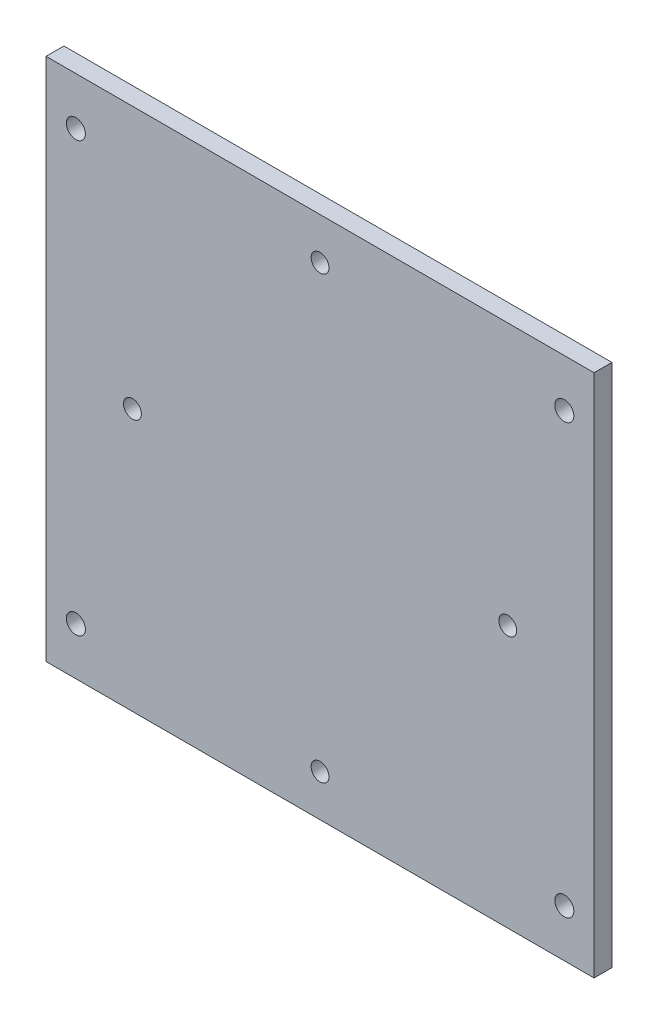
ISO-10303-21;
HEADER;
FILE_DESCRIPTION(('STEP AP214'),'2;1');
FILE_NAME('part.step','',(''),(''),'','','');
FILE_SCHEMA(('AUTOMOTIVE_DESIGN { 1 0 10303 214 1 1 1 1 }'));
ENDSEC;
DATA;
#1=APPLICATION_CONTEXT('core data for automotive mechanical design processes');
#2=APPLICATION_PROTOCOL_DEFINITION('international standard','automotive_design',2000,#1);
#3=PRODUCT_CONTEXT('',#1,'mechanical');
#4=PRODUCT('Part','Part','',(#3));
#5=PRODUCT_RELATED_PRODUCT_CATEGORY('part','',(#4));
#6=PRODUCT_DEFINITION_FORMATION('','',#4);
#7=PRODUCT_DEFINITION_CONTEXT('part definition',#1,'design');
#8=PRODUCT_DEFINITION('design','',#6,#7);
#9=PRODUCT_DEFINITION_SHAPE('','',#8);
#10=(LENGTH_UNIT() NAMED_UNIT(*) SI_UNIT(.MILLI.,.METRE.));
#11=(NAMED_UNIT(*) PLANE_ANGLE_UNIT() SI_UNIT($,.RADIAN.));
#12=(NAMED_UNIT(*) SI_UNIT($,.STERADIAN.) SOLID_ANGLE_UNIT());
#13=UNCERTAINTY_MEASURE_WITH_UNIT(LENGTH_MEASURE(1.E-05),#10,'distance_accuracy_value','');
#14=(GEOMETRIC_REPRESENTATION_CONTEXT(3) GLOBAL_UNCERTAINTY_ASSIGNED_CONTEXT((#13)) GLOBAL_UNIT_ASSIGNED_CONTEXT((#10,
#11,#12)) REPRESENTATION_CONTEXT('',''));
#15=CARTESIAN_POINT('',(0.,0.,0.));
#16=DIRECTION('',(0.,0.,1.));
#17=DIRECTION('',(1.,0.,0.));
#18=AXIS2_PLACEMENT_3D('',#15,#16,#17);
#19=CARTESIAN_POINT('',(0.,0.,3.));
#20=DIRECTION('',(0.,0.,-1.));
#21=DIRECTION('',(-1.,0.,0.));
#22=AXIS2_PLACEMENT_3D('',#19,#20,#21);
#23=PLANE('',#22);
#24=DIRECTION('',(0.,-1.,0.));
#25=VECTOR('',#24,1.);
#26=CARTESIAN_POINT('',(0.,0.,3.));
#27=LINE('',#26,#25);
#28=CARTESIAN_POINT('',(0.,88.,3.));
#29=VERTEX_POINT('',#28);
#30=CARTESIAN_POINT('',(0.,0.,3.));
#31=VERTEX_POINT('',#30);
#32=EDGE_CURVE('E98',#29,#31,#27,.T.);
#33=ORIENTED_EDGE('',*,*,#32,.T.);
#34=DIRECTION('',(1.,0.,0.));
#35=VECTOR('',#34,1.);
#36=CARTESIAN_POINT('',(0.,0.,3.));
#37=LINE('',#36,#35);
#38=CARTESIAN_POINT('',(92.,0.,3.));
#39=VERTEX_POINT('',#38);
#40=EDGE_CURVE('E93',#31,#39,#37,.T.);
#41=ORIENTED_EDGE('',*,*,#40,.T.);
#42=DIRECTION('',(0.,1.,0.));
#43=VECTOR('',#42,1.);
#44=CARTESIAN_POINT('',(92.,0.,3.));
#45=LINE('',#44,#43);
#46=CARTESIAN_POINT('',(92.,88.,3.));
#47=VERTEX_POINT('',#46);
#48=EDGE_CURVE('E96',#39,#47,#45,.T.);
#49=ORIENTED_EDGE('',*,*,#48,.T.);
#50=DIRECTION('',(-1.,0.,0.));
#51=VECTOR('',#50,1.);
#52=CARTESIAN_POINT('',(0.,88.,3.));
#53=LINE('',#52,#51);
#54=EDGE_CURVE('E63',#47,#29,#53,.T.);
#55=ORIENTED_EDGE('',*,*,#54,.T.);
#56=EDGE_LOOP('',(#33,#41,#49,#55));
#57=FACE_BOUND('',#56,.T.);
#58=CARTESIAN_POINT('',(5.,8.,3.));
#59=DIRECTION('',(0.,0.,1.));
#60=DIRECTION('',(1.,0.,0.));
#61=AXIS2_PLACEMENT_3D('',#58,#59,#60);
#62=CIRCLE('',#61,1.6);
#63=CARTESIAN_POINT('',(6.6,8.,3.));
#64=VERTEX_POINT('',#63);
#65=EDGE_CURVE('E118',#64,#64,#62,.T.);
#66=ORIENTED_EDGE('',*,*,#65,.F.);
#67=EDGE_LOOP('',(#66));
#68=FACE_BOUND('',#67,.T.);
#69=CARTESIAN_POINT('',(5.,80.,3.));
#70=DIRECTION('',(0.,0.,1.));
#71=DIRECTION('',(-1.,0.,0.));
#72=AXIS2_PLACEMENT_3D('',#69,#70,#71);
#73=CIRCLE('',#72,1.60000000000001);
#74=CARTESIAN_POINT('',(3.39999999999999,80.,3.));
#75=VERTEX_POINT('',#74);
#76=EDGE_CURVE('E140',#75,#75,#73,.T.);
#77=ORIENTED_EDGE('',*,*,#76,.F.);
#78=EDGE_LOOP('',(#77));
#79=FACE_BOUND('',#78,.T.);
#80=CARTESIAN_POINT('',(87.,8.,3.));
#81=DIRECTION('',(0.,0.,1.));
#82=DIRECTION('',(-1.,0.,0.));
#83=AXIS2_PLACEMENT_3D('',#80,#81,#82);
#84=CIRCLE('',#83,1.60000000000002);
#85=CARTESIAN_POINT('',(85.4,8.,3.));
#86=VERTEX_POINT('',#85);
#87=EDGE_CURVE('E148',#86,#86,#84,.T.);
#88=ORIENTED_EDGE('',*,*,#87,.F.);
#89=EDGE_LOOP('',(#88));
#90=FACE_BOUND('',#89,.T.);
#91=CARTESIAN_POINT('',(87.,80.,3.));
#92=DIRECTION('',(0.,0.,1.));
#93=DIRECTION('',(1.,0.,0.));
#94=AXIS2_PLACEMENT_3D('',#91,#92,#93);
#95=CIRCLE('',#94,1.60000000000002);
#96=CARTESIAN_POINT('',(88.6,80.,3.));
#97=VERTEX_POINT('',#96);
#98=EDGE_CURVE('E156',#97,#97,#95,.T.);
#99=ORIENTED_EDGE('',*,*,#98,.F.);
#100=EDGE_LOOP('',(#99));
#101=FACE_BOUND('',#100,.T.);
#102=CARTESIAN_POINT('',(46.,7.00000000000001,3.));
#103=DIRECTION('',(0.,0.,1.));
#104=DIRECTION('',(-1.,0.,0.));
#105=AXIS2_PLACEMENT_3D('',#102,#103,#104);
#106=CIRCLE('',#105,1.5);
#107=CARTESIAN_POINT('',(44.5,7.00000000000001,3.));
#108=VERTEX_POINT('',#107);
#109=EDGE_CURVE('E164',#108,#108,#106,.T.);
#110=ORIENTED_EDGE('',*,*,#109,.F.);
#111=EDGE_LOOP('',(#110));
#112=FACE_BOUND('',#111,.T.);
#113=CARTESIAN_POINT('',(14.5,44.,3.));
#114=DIRECTION('',(0.,0.,1.));
#115=DIRECTION('',(-1.,0.,0.));
#116=AXIS2_PLACEMENT_3D('',#113,#114,#115);
#117=CIRCLE('',#116,1.5);
#118=CARTESIAN_POINT('',(13.,44.,3.));
#119=VERTEX_POINT('',#118);
#120=EDGE_CURVE('E172',#119,#119,#117,.T.);
#121=ORIENTED_EDGE('',*,*,#120,.F.);
#122=EDGE_LOOP('',(#121));
#123=FACE_BOUND('',#122,.T.);
#124=CARTESIAN_POINT('',(46.,81.,3.));
#125=DIRECTION('',(0.,0.,1.));
#126=DIRECTION('',(1.,0.,0.));
#127=AXIS2_PLACEMENT_3D('',#124,#125,#126);
#128=CIRCLE('',#127,1.5);
#129=CARTESIAN_POINT('',(47.5,81.,3.));
#130=VERTEX_POINT('',#129);
#131=EDGE_CURVE('E180',#130,#130,#128,.T.);
#132=ORIENTED_EDGE('',*,*,#131,.F.);
#133=EDGE_LOOP('',(#132));
#134=FACE_BOUND('',#133,.T.);
#135=CARTESIAN_POINT('',(77.5,44.,3.));
#136=DIRECTION('',(0.,0.,1.));
#137=DIRECTION('',(1.,0.,0.));
#138=AXIS2_PLACEMENT_3D('',#135,#136,#137);
#139=CIRCLE('',#138,1.5);
#140=CARTESIAN_POINT('',(79.,44.,3.));
#141=VERTEX_POINT('',#140);
#142=EDGE_CURVE('E188',#141,#141,#139,.T.);
#143=ORIENTED_EDGE('',*,*,#142,.F.);
#144=EDGE_LOOP('',(#143));
#145=FACE_BOUND('',#144,.T.);
#146=ADVANCED_FACE('F45',(#57,#68,#79,#90,#101,#112,#123,#134,#145),#23,.F.);
#147=CARTESIAN_POINT('',(0.,0.,0.));
#148=DIRECTION('',(0.,0.,-1.));
#149=DIRECTION('',(-1.,0.,0.));
#150=AXIS2_PLACEMENT_3D('',#147,#148,#149);
#151=PLANE('',#150);
#152=CARTESIAN_POINT('',(46.,81.,0.));
#153=DIRECTION('',(0.,0.,1.));
#154=DIRECTION('',(1.,0.,0.));
#155=AXIS2_PLACEMENT_3D('',#152,#153,#154);
#156=CIRCLE('',#155,1.5);
#157=CARTESIAN_POINT('',(47.5,81.,0.));
#158=VERTEX_POINT('',#157);
#159=EDGE_CURVE('E184',#158,#158,#156,.T.);
#160=ORIENTED_EDGE('',*,*,#159,.T.);
#161=EDGE_LOOP('',(#160));
#162=FACE_BOUND('',#161,.T.);
#163=CARTESIAN_POINT('',(46.,7.00000000000001,0.));
#164=DIRECTION('',(0.,0.,1.));
#165=DIRECTION('',(-1.,0.,0.));
#166=AXIS2_PLACEMENT_3D('',#163,#164,#165);
#167=CIRCLE('',#166,1.5);
#168=CARTESIAN_POINT('',(44.5,7.00000000000001,0.));
#169=VERTEX_POINT('',#168);
#170=EDGE_CURVE('E168',#169,#169,#167,.T.);
#171=ORIENTED_EDGE('',*,*,#170,.T.);
#172=EDGE_LOOP('',(#171));
#173=FACE_BOUND('',#172,.T.);
#174=CARTESIAN_POINT('',(87.,8.,0.));
#175=DIRECTION('',(0.,0.,1.));
#176=DIRECTION('',(-1.,0.,0.));
#177=AXIS2_PLACEMENT_3D('',#174,#175,#176);
#178=CIRCLE('',#177,1.60000000000002);
#179=CARTESIAN_POINT('',(85.4,8.,0.));
#180=VERTEX_POINT('',#179);
#181=EDGE_CURVE('E152',#180,#180,#178,.T.);
#182=ORIENTED_EDGE('',*,*,#181,.T.);
#183=EDGE_LOOP('',(#182));
#184=FACE_BOUND('',#183,.T.);
#185=CARTESIAN_POINT('',(5.,8.,0.));
#186=DIRECTION('',(0.,0.,1.));
#187=DIRECTION('',(1.,0.,0.));
#188=AXIS2_PLACEMENT_3D('',#185,#186,#187);
#189=CIRCLE('',#188,1.6);
#190=CARTESIAN_POINT('',(6.6,8.,0.));
#191=VERTEX_POINT('',#190);
#192=EDGE_CURVE('E136',#191,#191,#189,.T.);
#193=ORIENTED_EDGE('',*,*,#192,.T.);
#194=EDGE_LOOP('',(#193));
#195=FACE_BOUND('',#194,.T.);
#196=DIRECTION('',(0.,-1.,0.));
#197=VECTOR('',#196,1.);
#198=CARTESIAN_POINT('',(0.,0.,0.));
#199=LINE('',#198,#197);
#200=CARTESIAN_POINT('',(0.,88.,0.));
#201=VERTEX_POINT('',#200);
#202=CARTESIAN_POINT('',(0.,0.,0.));
#203=VERTEX_POINT('',#202);
#204=EDGE_CURVE('E114',#201,#203,#199,.T.);
#205=ORIENTED_EDGE('',*,*,#204,.F.);
#206=DIRECTION('',(-1.,0.,0.));
#207=VECTOR('',#206,1.);
#208=CARTESIAN_POINT('',(0.,88.,0.));
#209=LINE('',#208,#207);
#210=CARTESIAN_POINT('',(92.,88.,0.));
#211=VERTEX_POINT('',#210);
#212=EDGE_CURVE('E86',#211,#201,#209,.T.);
#213=ORIENTED_EDGE('',*,*,#212,.F.);
#214=DIRECTION('',(0.,1.,0.));
#215=VECTOR('',#214,1.);
#216=CARTESIAN_POINT('',(92.,0.,0.));
#217=LINE('',#216,#215);
#218=CARTESIAN_POINT('',(92.,0.,0.));
#219=VERTEX_POINT('',#218);
#220=EDGE_CURVE('E80',#219,#211,#217,.T.);
#221=ORIENTED_EDGE('',*,*,#220,.F.);
#222=DIRECTION('',(1.,0.,0.));
#223=VECTOR('',#222,1.);
#224=CARTESIAN_POINT('',(0.,0.,0.));
#225=LINE('',#224,#223);
#226=EDGE_CURVE('E103',#203,#219,#225,.T.);
#227=ORIENTED_EDGE('',*,*,#226,.F.);
#228=EDGE_LOOP('',(#205,#213,#221,#227));
#229=FACE_BOUND('',#228,.T.);
#230=CARTESIAN_POINT('',(5.,80.,0.));
#231=DIRECTION('',(0.,0.,1.));
#232=DIRECTION('',(-1.,0.,0.));
#233=AXIS2_PLACEMENT_3D('',#230,#231,#232);
#234=CIRCLE('',#233,1.60000000000001);
#235=CARTESIAN_POINT('',(3.39999999999999,80.,0.));
#236=VERTEX_POINT('',#235);
#237=EDGE_CURVE('E144',#236,#236,#234,.T.);
#238=ORIENTED_EDGE('',*,*,#237,.T.);
#239=EDGE_LOOP('',(#238));
#240=FACE_BOUND('',#239,.T.);
#241=CARTESIAN_POINT('',(87.,80.,0.));
#242=DIRECTION('',(0.,0.,1.));
#243=DIRECTION('',(1.,0.,0.));
#244=AXIS2_PLACEMENT_3D('',#241,#242,#243);
#245=CIRCLE('',#244,1.60000000000002);
#246=CARTESIAN_POINT('',(88.6,80.,0.));
#247=VERTEX_POINT('',#246);
#248=EDGE_CURVE('E160',#247,#247,#245,.T.);
#249=ORIENTED_EDGE('',*,*,#248,.T.);
#250=EDGE_LOOP('',(#249));
#251=FACE_BOUND('',#250,.T.);
#252=CARTESIAN_POINT('',(14.5,44.,0.));
#253=DIRECTION('',(0.,0.,1.));
#254=DIRECTION('',(-1.,0.,0.));
#255=AXIS2_PLACEMENT_3D('',#252,#253,#254);
#256=CIRCLE('',#255,1.5);
#257=CARTESIAN_POINT('',(13.,44.,0.));
#258=VERTEX_POINT('',#257);
#259=EDGE_CURVE('E176',#258,#258,#256,.T.);
#260=ORIENTED_EDGE('',*,*,#259,.T.);
#261=EDGE_LOOP('',(#260));
#262=FACE_BOUND('',#261,.T.);
#263=CARTESIAN_POINT('',(77.5,44.,0.));
#264=DIRECTION('',(0.,0.,1.));
#265=DIRECTION('',(1.,0.,0.));
#266=AXIS2_PLACEMENT_3D('',#263,#264,#265);
#267=CIRCLE('',#266,1.5);
#268=CARTESIAN_POINT('',(79.,44.,0.));
#269=VERTEX_POINT('',#268);
#270=EDGE_CURVE('E192',#269,#269,#267,.T.);
#271=ORIENTED_EDGE('',*,*,#270,.T.);
#272=EDGE_LOOP('',(#271));
#273=FACE_BOUND('',#272,.T.);
#274=ADVANCED_FACE('F131',(#162,#173,#184,#195,#229,#240,#251,#262,#273),#151,.T.);
#275=CARTESIAN_POINT('',(0.,0.,3.));
#276=DIRECTION('',(1.,0.,0.));
#277=DIRECTION('',(0.,0.,-1.));
#278=AXIS2_PLACEMENT_3D('',#275,#276,#277);
#279=PLANE('',#278);
#280=ORIENTED_EDGE('',*,*,#204,.T.);
#281=DIRECTION('',(0.,0.,-1.));
#282=VECTOR('',#281,1.);
#283=CARTESIAN_POINT('',(0.,0.,3.));
#284=LINE('',#283,#282);
#285=EDGE_CURVE('E11',#31,#203,#284,.T.);
#286=ORIENTED_EDGE('',*,*,#285,.F.);
#287=ORIENTED_EDGE('',*,*,#32,.F.);
#288=DIRECTION('',(0.,0.,-1.));
#289=VECTOR('',#288,1.);
#290=CARTESIAN_POINT('',(0.,88.,3.));
#291=LINE('',#290,#289);
#292=EDGE_CURVE('E110',#29,#201,#291,.T.);
#293=ORIENTED_EDGE('',*,*,#292,.T.);
#294=EDGE_LOOP('',(#280,#286,#287,#293));
#295=FACE_BOUND('',#294,.T.);
#296=ADVANCED_FACE('F47',(#295),#279,.F.);
#297=CARTESIAN_POINT('',(0.,0.,3.));
#298=DIRECTION('',(0.,1.,0.));
#299=DIRECTION('',(0.,0.,1.));
#300=AXIS2_PLACEMENT_3D('',#297,#298,#299);
#301=PLANE('',#300);
#302=ORIENTED_EDGE('',*,*,#226,.T.);
#303=DIRECTION('',(0.,0.,-1.));
#304=VECTOR('',#303,1.);
#305=CARTESIAN_POINT('',(92.,0.,3.));
#306=LINE('',#305,#304);
#307=EDGE_CURVE('E55',#39,#219,#306,.T.);
#308=ORIENTED_EDGE('',*,*,#307,.F.);
#309=ORIENTED_EDGE('',*,*,#40,.F.);
#310=ORIENTED_EDGE('',*,*,#285,.T.);
#311=EDGE_LOOP('',(#302,#308,#309,#310));
#312=FACE_BOUND('',#311,.T.);
#313=ADVANCED_FACE('F102',(#312),#301,.F.);
#314=CARTESIAN_POINT('',(92.,0.,3.));
#315=DIRECTION('',(-1.,0.,0.));
#316=DIRECTION('',(0.,0.,1.));
#317=AXIS2_PLACEMENT_3D('',#314,#315,#316);
#318=PLANE('',#317);
#319=ORIENTED_EDGE('',*,*,#220,.T.);
#320=DIRECTION('',(0.,0.,-1.));
#321=VECTOR('',#320,1.);
#322=CARTESIAN_POINT('',(92.,88.,3.));
#323=LINE('',#322,#321);
#324=EDGE_CURVE('E105',#47,#211,#323,.T.);
#325=ORIENTED_EDGE('',*,*,#324,.F.);
#326=ORIENTED_EDGE('',*,*,#48,.F.);
#327=ORIENTED_EDGE('',*,*,#307,.T.);
#328=EDGE_LOOP('',(#319,#325,#326,#327));
#329=FACE_BOUND('',#328,.T.);
#330=ADVANCED_FACE('F106',(#329),#318,.F.);
#331=CARTESIAN_POINT('',(0.,88.,3.));
#332=DIRECTION('',(0.,-1.,0.));
#333=DIRECTION('',(1.,0.,0.));
#334=AXIS2_PLACEMENT_3D('',#331,#332,#333);
#335=PLANE('',#334);
#336=ORIENTED_EDGE('',*,*,#212,.T.);
#337=ORIENTED_EDGE('',*,*,#292,.F.);
#338=ORIENTED_EDGE('',*,*,#54,.F.);
#339=ORIENTED_EDGE('',*,*,#324,.T.);
#340=EDGE_LOOP('',(#336,#337,#338,#339));
#341=FACE_BOUND('',#340,.T.);
#342=ADVANCED_FACE('F128',(#341),#335,.F.);
#343=CARTESIAN_POINT('',(5.,8.,3.));
#344=DIRECTION('',(0.,0.,-1.));
#345=DIRECTION('',(-1.,0.,0.));
#346=AXIS2_PLACEMENT_3D('',#343,#344,#345);
#347=CYLINDRICAL_SURFACE('',#346,1.6);
#348=ORIENTED_EDGE('',*,*,#65,.T.);
#349=EDGE_LOOP('',(#348));
#350=FACE_BOUND('',#349,.T.);
#351=ORIENTED_EDGE('',*,*,#192,.F.);
#352=EDGE_LOOP('',(#351));
#353=FACE_BOUND('',#352,.T.);
#354=ADVANCED_FACE('F211',(#350,#353),#347,.F.);
#355=CARTESIAN_POINT('',(5.,80.,3.));
#356=DIRECTION('',(0.,0.,-1.));
#357=DIRECTION('',(-1.,0.,0.));
#358=AXIS2_PLACEMENT_3D('',#355,#356,#357);
#359=CYLINDRICAL_SURFACE('',#358,1.60000000000001);
#360=ORIENTED_EDGE('',*,*,#76,.T.);
#361=EDGE_LOOP('',(#360));
#362=FACE_BOUND('',#361,.T.);
#363=ORIENTED_EDGE('',*,*,#237,.F.);
#364=EDGE_LOOP('',(#363));
#365=FACE_BOUND('',#364,.T.);
#366=ADVANCED_FACE('F256',(#362,#365),#359,.F.);
#367=CARTESIAN_POINT('',(87.,8.,3.));
#368=DIRECTION('',(0.,0.,-1.));
#369=DIRECTION('',(-1.,0.,0.));
#370=AXIS2_PLACEMENT_3D('',#367,#368,#369);
#371=CYLINDRICAL_SURFACE('',#370,1.60000000000002);
#372=ORIENTED_EDGE('',*,*,#87,.T.);
#373=EDGE_LOOP('',(#372));
#374=FACE_BOUND('',#373,.T.);
#375=ORIENTED_EDGE('',*,*,#181,.F.);
#376=EDGE_LOOP('',(#375));
#377=FACE_BOUND('',#376,.T.);
#378=ADVANCED_FACE('F264',(#374,#377),#371,.F.);
#379=CARTESIAN_POINT('',(87.,80.,3.));
#380=DIRECTION('',(0.,0.,-1.));
#381=DIRECTION('',(-1.,0.,0.));
#382=AXIS2_PLACEMENT_3D('',#379,#380,#381);
#383=CYLINDRICAL_SURFACE('',#382,1.60000000000002);
#384=ORIENTED_EDGE('',*,*,#98,.T.);
#385=EDGE_LOOP('',(#384));
#386=FACE_BOUND('',#385,.T.);
#387=ORIENTED_EDGE('',*,*,#248,.F.);
#388=EDGE_LOOP('',(#387));
#389=FACE_BOUND('',#388,.T.);
#390=ADVANCED_FACE('F272',(#386,#389),#383,.F.);
#391=CARTESIAN_POINT('',(46.,7.00000000000001,3.));
#392=DIRECTION('',(0.,0.,-1.));
#393=DIRECTION('',(-1.,0.,0.));
#394=AXIS2_PLACEMENT_3D('',#391,#392,#393);
#395=CYLINDRICAL_SURFACE('',#394,1.5);
#396=ORIENTED_EDGE('',*,*,#109,.T.);
#397=EDGE_LOOP('',(#396));
#398=FACE_BOUND('',#397,.T.);
#399=ORIENTED_EDGE('',*,*,#170,.F.);
#400=EDGE_LOOP('',(#399));
#401=FACE_BOUND('',#400,.T.);
#402=ADVANCED_FACE('F281',(#398,#401),#395,.F.);
#403=CARTESIAN_POINT('',(14.5,44.,3.));
#404=DIRECTION('',(0.,0.,-1.));
#405=DIRECTION('',(-1.,0.,0.));
#406=AXIS2_PLACEMENT_3D('',#403,#404,#405);
#407=CYLINDRICAL_SURFACE('',#406,1.5);
#408=ORIENTED_EDGE('',*,*,#120,.T.);
#409=EDGE_LOOP('',(#408));
#410=FACE_BOUND('',#409,.T.);
#411=ORIENTED_EDGE('',*,*,#259,.F.);
#412=EDGE_LOOP('',(#411));
#413=FACE_BOUND('',#412,.T.);
#414=ADVANCED_FACE('F290',(#410,#413),#407,.F.);
#415=CARTESIAN_POINT('',(46.,81.,3.));
#416=DIRECTION('',(0.,0.,-1.));
#417=DIRECTION('',(-1.,0.,0.));
#418=AXIS2_PLACEMENT_3D('',#415,#416,#417);
#419=CYLINDRICAL_SURFACE('',#418,1.5);
#420=ORIENTED_EDGE('',*,*,#131,.T.);
#421=EDGE_LOOP('',(#420));
#422=FACE_BOUND('',#421,.T.);
#423=ORIENTED_EDGE('',*,*,#159,.F.);
#424=EDGE_LOOP('',(#423));
#425=FACE_BOUND('',#424,.T.);
#426=ADVANCED_FACE('F299',(#422,#425),#419,.F.);
#427=CARTESIAN_POINT('',(77.5,44.,3.));
#428=DIRECTION('',(0.,0.,-1.));
#429=DIRECTION('',(-1.,0.,0.));
#430=AXIS2_PLACEMENT_3D('',#427,#428,#429);
#431=CYLINDRICAL_SURFACE('',#430,1.5);
#432=ORIENTED_EDGE('',*,*,#142,.T.);
#433=EDGE_LOOP('',(#432));
#434=FACE_BOUND('',#433,.T.);
#435=ORIENTED_EDGE('',*,*,#270,.F.);
#436=EDGE_LOOP('',(#435));
#437=FACE_BOUND('',#436,.T.);
#438=ADVANCED_FACE('F200',(#434,#437),#431,.F.);
#439=CLOSED_SHELL('',(#146,#274,#296,#313,#330,#342,#354,#366,#378,#390,#402,#414,#426,#438));
#440=MANIFOLD_SOLID_BREP('B2',#439);
#441=ADVANCED_BREP_SHAPE_REPRESENTATION('',(#18,#440),#14);
#442=SHAPE_DEFINITION_REPRESENTATION(#9,#441);
ENDSEC;
END-ISO-10303-21;
